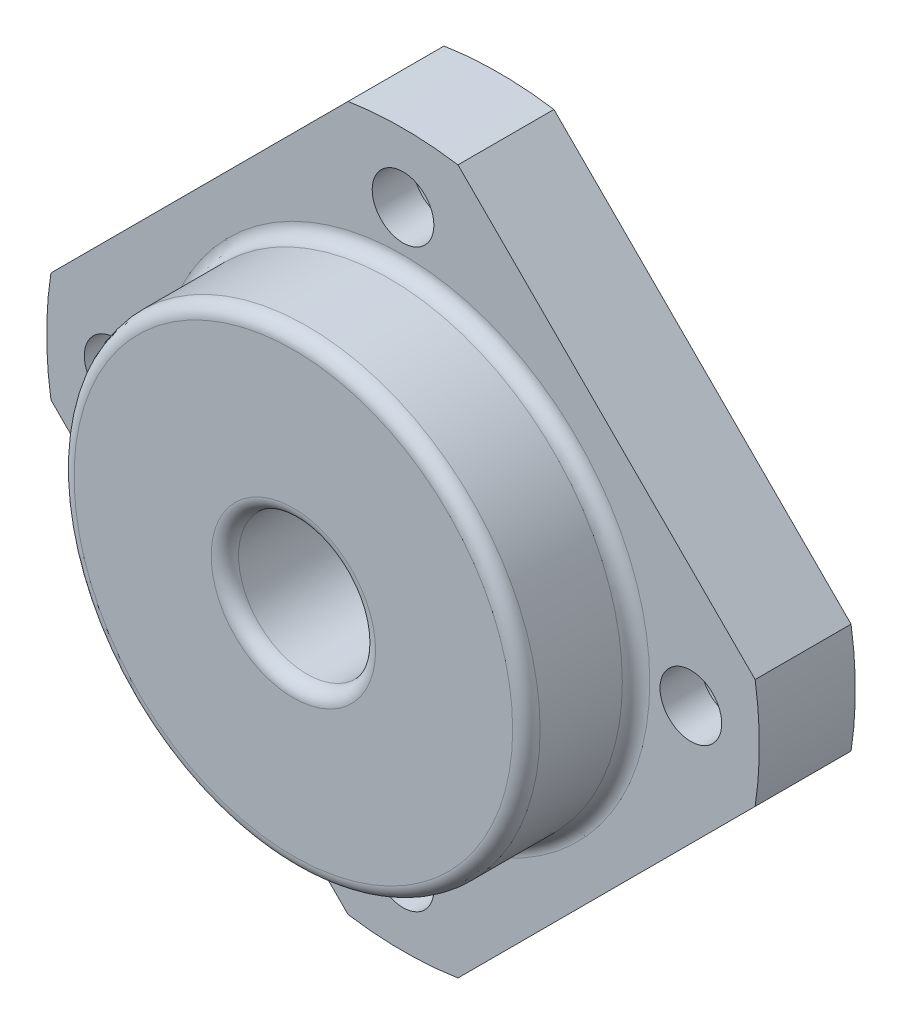
ISO-10303-21;
HEADER;
FILE_DESCRIPTION(('STEP AP214'),'2;1');
FILE_NAME('part.step','',(''),(''),'','','');
FILE_SCHEMA(('AUTOMOTIVE_DESIGN { 1 0 10303 214 1 1 1 1 }'));
ENDSEC;
DATA;
#1=APPLICATION_CONTEXT('core data for automotive mechanical design processes');
#2=APPLICATION_PROTOCOL_DEFINITION('international standard','automotive_design',2000,#1);
#3=PRODUCT_CONTEXT('',#1,'mechanical');
#4=PRODUCT('Part','Part','',(#3));
#5=PRODUCT_RELATED_PRODUCT_CATEGORY('part','',(#4));
#6=PRODUCT_DEFINITION_FORMATION('','',#4);
#7=PRODUCT_DEFINITION_CONTEXT('part definition',#1,'design');
#8=PRODUCT_DEFINITION('design','',#6,#7);
#9=PRODUCT_DEFINITION_SHAPE('','',#8);
#10=(LENGTH_UNIT() NAMED_UNIT(*) SI_UNIT(.MILLI.,.METRE.));
#11=(NAMED_UNIT(*) PLANE_ANGLE_UNIT() SI_UNIT($,.RADIAN.));
#12=(NAMED_UNIT(*) SI_UNIT($,.STERADIAN.) SOLID_ANGLE_UNIT());
#13=UNCERTAINTY_MEASURE_WITH_UNIT(LENGTH_MEASURE(1.E-05),#10,'distance_accuracy_value','');
#14=(GEOMETRIC_REPRESENTATION_CONTEXT(3) GLOBAL_UNCERTAINTY_ASSIGNED_CONTEXT((#13)) GLOBAL_UNIT_ASSIGNED_CONTEXT((#10,
#11,#12)) REPRESENTATION_CONTEXT('',''));
#15=CARTESIAN_POINT('',(0.,0.,0.));
#16=DIRECTION('',(0.,0.,1.));
#17=DIRECTION('',(1.,0.,0.));
#18=AXIS2_PLACEMENT_3D('',#15,#16,#17);
#19=CARTESIAN_POINT('',(14.8492424049174,14.8492424049176,7.));
#20=DIRECTION('',(-0.707106781186539,-0.707106781186556,0.));
#21=DIRECTION('',(0.707106781186556,-0.707106781186539,0.));
#22=AXIS2_PLACEMENT_3D('',#19,#20,#21);
#23=PLANE('',#22);
#24=DIRECTION('',(-0.707106781186556,0.707106781186539,0.));
#25=VECTOR('',#24,1.);
#26=CARTESIAN_POINT('',(14.8492424049174,14.8492424049176,0.));
#27=LINE('',#26,#25);
#28=CARTESIAN_POINT('',(25.6889840992569,4.00950071057832,0.));
#29=VERTEX_POINT('',#28);
#30=CARTESIAN_POINT('',(4.00950071057779,25.688984099257,0.));
#31=VERTEX_POINT('',#30);
#32=EDGE_CURVE('E86',#29,#31,#27,.T.);
#33=ORIENTED_EDGE('',*,*,#32,.T.);
#34=DIRECTION('',(0.,0.,-1.));
#35=VECTOR('',#34,1.);
#36=CARTESIAN_POINT('',(4.00950071057779,25.688984099257,7.));
#37=LINE('',#36,#35);
#38=CARTESIAN_POINT('',(4.00950071057779,25.688984099257,7.));
#39=VERTEX_POINT('',#38);
#40=EDGE_CURVE('E160',#39,#31,#37,.T.);
#41=ORIENTED_EDGE('',*,*,#40,.F.);
#42=DIRECTION('',(-0.707106781186554,0.707106781186541,0.));
#43=VECTOR('',#42,1.);
#44=CARTESIAN_POINT('',(14.8492424049174,14.8492424049176,7.));
#45=LINE('',#44,#43);
#46=CARTESIAN_POINT('',(25.6889840992569,4.00950071057832,7.));
#47=VERTEX_POINT('',#46);
#48=EDGE_CURVE('E92',#47,#39,#45,.T.);
#49=ORIENTED_EDGE('',*,*,#48,.F.);
#50=DIRECTION('',(0.,0.,-1.));
#51=VECTOR('',#50,1.);
#52=CARTESIAN_POINT('',(25.6889840992569,4.00950071057832,7.));
#53=LINE('',#52,#51);
#54=EDGE_CURVE('E127',#47,#29,#53,.T.);
#55=ORIENTED_EDGE('',*,*,#54,.T.);
#56=EDGE_LOOP('',(#33,#41,#49,#55));
#57=FACE_BOUND('',#56,.T.);
#58=ADVANCED_FACE('F34',(#57),#23,.F.);
#59=CARTESIAN_POINT('',(0.,0.,7.));
#60=DIRECTION('',(0.,0.,-1.));
#61=DIRECTION('',(-1.,0.,0.));
#62=AXIS2_PLACEMENT_3D('',#59,#60,#61);
#63=CYLINDRICAL_SURFACE('',#62,26.);
#64=CARTESIAN_POINT('',(0.,0.,0.));
#65=DIRECTION('',(0.,0.,1.));
#66=DIRECTION('',(1.,0.,0.));
#67=AXIS2_PLACEMENT_3D('',#64,#65,#66);
#68=CIRCLE('',#67,26.);
#69=CARTESIAN_POINT('',(-4.00950071057814,25.6889840992569,0.));
#70=VERTEX_POINT('',#69);
#71=EDGE_CURVE('E132',#31,#70,#68,.T.);
#72=ORIENTED_EDGE('',*,*,#71,.T.);
#73=DIRECTION('',(0.,0.,-1.));
#74=VECTOR('',#73,1.);
#75=CARTESIAN_POINT('',(-4.00950071057814,25.6889840992569,7.));
#76=LINE('',#75,#74);
#77=CARTESIAN_POINT('',(-4.00950071057814,25.6889840992569,7.));
#78=VERTEX_POINT('',#77);
#79=EDGE_CURVE('E157',#78,#70,#76,.T.);
#80=ORIENTED_EDGE('',*,*,#79,.F.);
#81=CARTESIAN_POINT('',(0.,0.,7.));
#82=DIRECTION('',(0.,0.,1.));
#83=DIRECTION('',(1.,0.,0.));
#84=AXIS2_PLACEMENT_3D('',#81,#82,#83);
#85=CIRCLE('',#84,26.);
#86=EDGE_CURVE('E343',#39,#78,#85,.T.);
#87=ORIENTED_EDGE('',*,*,#86,.F.);
#88=ORIENTED_EDGE('',*,*,#40,.T.);
#89=EDGE_LOOP('',(#72,#80,#87,#88));
#90=FACE_BOUND('',#89,.T.);
#91=ADVANCED_FACE('F208',(#90),#63,.T.);
#92=CARTESIAN_POINT('',(-14.8492424049176,14.8492424049174,7.));
#93=DIRECTION('',(0.707106781186554,-0.707106781186541,0.));
#94=DIRECTION('',(0.707106781186541,0.707106781186554,0.));
#95=AXIS2_PLACEMENT_3D('',#92,#93,#94);
#96=PLANE('',#95);
#97=DIRECTION('',(-0.707106781186541,-0.707106781186554,0.));
#98=VECTOR('',#97,1.);
#99=CARTESIAN_POINT('',(-14.8492424049176,14.8492424049174,0.));
#100=LINE('',#99,#98);
#101=CARTESIAN_POINT('',(-25.6889840992569,4.00950071057788,0.));
#102=VERTEX_POINT('',#101);
#103=EDGE_CURVE('E136',#70,#102,#100,.T.);
#104=ORIENTED_EDGE('',*,*,#103,.T.);
#105=DIRECTION('',(0.,0.,-1.));
#106=VECTOR('',#105,1.);
#107=CARTESIAN_POINT('',(-25.6889840992569,4.00950071057788,7.));
#108=LINE('',#107,#106);
#109=CARTESIAN_POINT('',(-25.6889840992569,4.00950071057788,7.));
#110=VERTEX_POINT('',#109);
#111=EDGE_CURVE('E154',#110,#102,#108,.T.);
#112=ORIENTED_EDGE('',*,*,#111,.F.);
#113=DIRECTION('',(-0.707106781186546,-0.707106781186549,0.));
#114=VECTOR('',#113,1.);
#115=CARTESIAN_POINT('',(-14.8492424049176,14.8492424049174,7.));
#116=LINE('',#115,#114);
#117=EDGE_CURVE('E345',#78,#110,#116,.T.);
#118=ORIENTED_EDGE('',*,*,#117,.F.);
#119=ORIENTED_EDGE('',*,*,#79,.T.);
#120=EDGE_LOOP('',(#104,#112,#118,#119));
#121=FACE_BOUND('',#120,.T.);
#122=ADVANCED_FACE('F214',(#121),#96,.F.);
#123=CARTESIAN_POINT('',(0.,0.,7.));
#124=DIRECTION('',(0.,0.,-1.));
#125=DIRECTION('',(-1.,0.,0.));
#126=AXIS2_PLACEMENT_3D('',#123,#124,#125);
#127=CYLINDRICAL_SURFACE('',#126,26.);
#128=CARTESIAN_POINT('',(0.,0.,0.));
#129=DIRECTION('',(0.,0.,1.));
#130=DIRECTION('',(1.,0.,0.));
#131=AXIS2_PLACEMENT_3D('',#128,#129,#130);
#132=CIRCLE('',#131,26.);
#133=CARTESIAN_POINT('',(-25.6889840992569,-4.00950071057823,0.));
#134=VERTEX_POINT('',#133);
#135=EDGE_CURVE('E138',#102,#134,#132,.T.);
#136=ORIENTED_EDGE('',*,*,#135,.T.);
#137=DIRECTION('',(0.,0.,-1.));
#138=VECTOR('',#137,1.);
#139=CARTESIAN_POINT('',(-25.6889840992569,-4.00950071057823,7.));
#140=LINE('',#139,#138);
#141=CARTESIAN_POINT('',(-25.6889840992569,-4.00950071057823,7.));
#142=VERTEX_POINT('',#141);
#143=EDGE_CURVE('E151',#142,#134,#140,.T.);
#144=ORIENTED_EDGE('',*,*,#143,.F.);
#145=CARTESIAN_POINT('',(0.,0.,7.));
#146=DIRECTION('',(0.,0.,1.));
#147=DIRECTION('',(1.,0.,0.));
#148=AXIS2_PLACEMENT_3D('',#145,#146,#147);
#149=CIRCLE('',#148,26.);
#150=EDGE_CURVE('E347',#110,#142,#149,.T.);
#151=ORIENTED_EDGE('',*,*,#150,.F.);
#152=ORIENTED_EDGE('',*,*,#111,.T.);
#153=EDGE_LOOP('',(#136,#144,#151,#152));
#154=FACE_BOUND('',#153,.T.);
#155=ADVANCED_FACE('F220',(#154),#127,.T.);
#156=CARTESIAN_POINT('',(-14.8492424049174,-14.8492424049176,7.));
#157=DIRECTION('',(0.707106781186541,0.707106781186554,0.));
#158=DIRECTION('',(-0.707106781186554,0.707106781186541,0.));
#159=AXIS2_PLACEMENT_3D('',#156,#157,#158);
#160=PLANE('',#159);
#161=DIRECTION('',(0.707106781186554,-0.707106781186541,0.));
#162=VECTOR('',#161,1.);
#163=CARTESIAN_POINT('',(-14.8492424049174,-14.8492424049176,0.));
#164=LINE('',#163,#162);
#165=CARTESIAN_POINT('',(-4.00950071057787,-25.6889840992569,0.));
#166=VERTEX_POINT('',#165);
#167=EDGE_CURVE('E141',#134,#166,#164,.T.);
#168=ORIENTED_EDGE('',*,*,#167,.T.);
#169=DIRECTION('',(0.,0.,-1.));
#170=VECTOR('',#169,1.);
#171=CARTESIAN_POINT('',(-4.00950071057787,-25.6889840992569,7.));
#172=LINE('',#171,#170);
#173=CARTESIAN_POINT('',(-4.00950071057787,-25.6889840992569,7.));
#174=VERTEX_POINT('',#173);
#175=EDGE_CURVE('E122',#174,#166,#172,.T.);
#176=ORIENTED_EDGE('',*,*,#175,.F.);
#177=DIRECTION('',(0.707106781186552,-0.707106781186544,0.));
#178=VECTOR('',#177,1.);
#179=CARTESIAN_POINT('',(-14.8492424049174,-14.8492424049176,7.));
#180=LINE('',#179,#178);
#181=EDGE_CURVE('E112',#142,#174,#180,.T.);
#182=ORIENTED_EDGE('',*,*,#181,.F.);
#183=ORIENTED_EDGE('',*,*,#143,.T.);
#184=EDGE_LOOP('',(#168,#176,#182,#183));
#185=FACE_BOUND('',#184,.T.);
#186=ADVANCED_FACE('F224',(#185),#160,.F.);
#187=CARTESIAN_POINT('',(0.,0.,7.));
#188=DIRECTION('',(0.,0.,-1.));
#189=DIRECTION('',(-1.,0.,0.));
#190=AXIS2_PLACEMENT_3D('',#187,#188,#189);
#191=CYLINDRICAL_SURFACE('',#190,26.);
#192=CARTESIAN_POINT('',(0.,0.,0.));
#193=DIRECTION('',(0.,0.,1.));
#194=DIRECTION('',(1.,0.,0.));
#195=AXIS2_PLACEMENT_3D('',#192,#193,#194);
#196=CIRCLE('',#195,26.);
#197=CARTESIAN_POINT('',(4.00950071057833,-25.6889840992569,0.));
#198=VERTEX_POINT('',#197);
#199=EDGE_CURVE('E121',#166,#198,#196,.T.);
#200=ORIENTED_EDGE('',*,*,#199,.T.);
#201=DIRECTION('',(0.,0.,-1.));
#202=VECTOR('',#201,1.);
#203=CARTESIAN_POINT('',(4.00950071057833,-25.6889840992569,7.));
#204=LINE('',#203,#202);
#205=CARTESIAN_POINT('',(4.00950071057833,-25.6889840992569,7.));
#206=VERTEX_POINT('',#205);
#207=EDGE_CURVE('E118',#206,#198,#204,.T.);
#208=ORIENTED_EDGE('',*,*,#207,.F.);
#209=CARTESIAN_POINT('',(0.,0.,7.));
#210=DIRECTION('',(0.,0.,1.));
#211=DIRECTION('',(1.,0.,0.));
#212=AXIS2_PLACEMENT_3D('',#209,#210,#211);
#213=CIRCLE('',#212,26.);
#214=EDGE_CURVE('E106',#174,#206,#213,.T.);
#215=ORIENTED_EDGE('',*,*,#214,.F.);
#216=ORIENTED_EDGE('',*,*,#175,.T.);
#217=EDGE_LOOP('',(#200,#208,#215,#216));
#218=FACE_BOUND('',#217,.T.);
#219=ADVANCED_FACE('F119',(#218),#191,.T.);
#220=CARTESIAN_POINT('',(14.8492424049176,-14.8492424049174,7.));
#221=DIRECTION('',(-0.707106781186559,0.707106781186536,0.));
#222=DIRECTION('',(-0.707106781186536,-0.707106781186559,0.));
#223=AXIS2_PLACEMENT_3D('',#220,#221,#222);
#224=PLANE('',#223);
#225=DIRECTION('',(0.707106781186536,0.707106781186559,0.));
#226=VECTOR('',#225,1.);
#227=CARTESIAN_POINT('',(14.8492424049176,-14.8492424049174,0.));
#228=LINE('',#227,#226);
#229=CARTESIAN_POINT('',(25.688984099257,-4.0095007105777,0.));
#230=VERTEX_POINT('',#229);
#231=EDGE_CURVE('E79',#198,#230,#228,.T.);
#232=ORIENTED_EDGE('',*,*,#231,.T.);
#233=DIRECTION('',(0.,0.,-1.));
#234=VECTOR('',#233,1.);
#235=CARTESIAN_POINT('',(25.688984099257,-4.0095007105777,7.));
#236=LINE('',#235,#234);
#237=CARTESIAN_POINT('',(25.688984099257,-4.0095007105777,7.));
#238=VERTEX_POINT('',#237);
#239=EDGE_CURVE('E123',#238,#230,#236,.T.);
#240=ORIENTED_EDGE('',*,*,#239,.F.);
#241=DIRECTION('',(0.707106781186541,0.707106781186554,0.));
#242=VECTOR('',#241,1.);
#243=CARTESIAN_POINT('',(14.8492424049176,-14.8492424049174,7.));
#244=LINE('',#243,#242);
#245=EDGE_CURVE('E110',#206,#238,#244,.T.);
#246=ORIENTED_EDGE('',*,*,#245,.F.);
#247=ORIENTED_EDGE('',*,*,#207,.T.);
#248=EDGE_LOOP('',(#232,#240,#246,#247));
#249=FACE_BOUND('',#248,.T.);
#250=ADVANCED_FACE('F125',(#249),#224,.F.);
#251=CARTESIAN_POINT('',(0.,0.,7.));
#252=DIRECTION('',(0.,0.,-1.));
#253=DIRECTION('',(-1.,0.,0.));
#254=AXIS2_PLACEMENT_3D('',#251,#252,#253);
#255=CYLINDRICAL_SURFACE('',#254,26.);
#256=CARTESIAN_POINT('',(0.,0.,0.));
#257=DIRECTION('',(0.,0.,1.));
#258=DIRECTION('',(1.,0.,0.));
#259=AXIS2_PLACEMENT_3D('',#256,#257,#258);
#260=CIRCLE('',#259,26.);
#261=EDGE_CURVE('E145',#230,#29,#260,.T.);
#262=ORIENTED_EDGE('',*,*,#261,.T.);
#263=ORIENTED_EDGE('',*,*,#54,.F.);
#264=CARTESIAN_POINT('',(0.,0.,7.));
#265=DIRECTION('',(0.,0.,1.));
#266=DIRECTION('',(1.,0.,0.));
#267=AXIS2_PLACEMENT_3D('',#264,#265,#266);
#268=CIRCLE('',#267,26.);
#269=EDGE_CURVE('E51',#238,#47,#268,.T.);
#270=ORIENTED_EDGE('',*,*,#269,.F.);
#271=ORIENTED_EDGE('',*,*,#239,.T.);
#272=EDGE_LOOP('',(#262,#263,#270,#271));
#273=FACE_BOUND('',#272,.T.);
#274=ADVANCED_FACE('F233',(#273),#255,.T.);
#275=CARTESIAN_POINT('',(0.,0.,7.));
#276=DIRECTION('',(0.,0.,1.));
#277=DIRECTION('',(1.,0.,0.));
#278=AXIS2_PLACEMENT_3D('',#275,#276,#277);
#279=PLANE('',#278);
#280=CARTESIAN_POINT('',(0.,0.,7.));
#281=DIRECTION('',(0.,0.,1.));
#282=DIRECTION('',(1.,0.,0.));
#283=AXIS2_PLACEMENT_3D('',#280,#281,#282);
#284=CIRCLE('',#283,18.);
#285=CARTESIAN_POINT('',(18.,0.,7.));
#286=VERTEX_POINT('',#285);
#287=EDGE_CURVE('E183',#286,#286,#284,.F.);
#288=ORIENTED_EDGE('',*,*,#287,.T.);
#289=EDGE_LOOP('',(#288));
#290=FACE_BOUND('',#289,.T.);
#291=CARTESIAN_POINT('',(0.,21.0000000000001,7.));
#292=DIRECTION('',(0.,0.,1.));
#293=DIRECTION('',(1.,0.,0.));
#294=AXIS2_PLACEMENT_3D('',#291,#292,#293);
#295=CIRCLE('',#294,2.25);
#296=CARTESIAN_POINT('',(2.25,21.0000000000001,7.));
#297=VERTEX_POINT('',#296);
#298=EDGE_CURVE('E174',#297,#297,#295,.T.);
#299=ORIENTED_EDGE('',*,*,#298,.F.);
#300=EDGE_LOOP('',(#299));
#301=FACE_BOUND('',#300,.T.);
#302=CARTESIAN_POINT('',(21.0000000000001,0.,7.));
#303=DIRECTION('',(0.,0.,1.));
#304=DIRECTION('',(1.,0.,0.));
#305=AXIS2_PLACEMENT_3D('',#302,#303,#304);
#306=CIRCLE('',#305,2.25);
#307=CARTESIAN_POINT('',(23.2500000000001,0.,7.));
#308=VERTEX_POINT('',#307);
#309=EDGE_CURVE('E171',#308,#308,#306,.T.);
#310=ORIENTED_EDGE('',*,*,#309,.F.);
#311=EDGE_LOOP('',(#310));
#312=FACE_BOUND('',#311,.T.);
#313=CARTESIAN_POINT('',(-21.0000000000001,0.,7.));
#314=DIRECTION('',(0.,0.,1.));
#315=DIRECTION('',(1.,0.,0.));
#316=AXIS2_PLACEMENT_3D('',#313,#314,#315);
#317=CIRCLE('',#316,2.25);
#318=CARTESIAN_POINT('',(-18.7500000000001,0.,7.));
#319=VERTEX_POINT('',#318);
#320=EDGE_CURVE('E167',#319,#319,#317,.T.);
#321=ORIENTED_EDGE('',*,*,#320,.F.);
#322=EDGE_LOOP('',(#321));
#323=FACE_BOUND('',#322,.T.);
#324=CARTESIAN_POINT('',(0.,-21.0000000000001,7.));
#325=DIRECTION('',(0.,0.,1.));
#326=DIRECTION('',(1.,0.,0.));
#327=AXIS2_PLACEMENT_3D('',#324,#325,#326);
#328=CIRCLE('',#327,2.25);
#329=CARTESIAN_POINT('',(2.25,-21.0000000000001,7.));
#330=VERTEX_POINT('',#329);
#331=EDGE_CURVE('E164',#330,#330,#328,.T.);
#332=ORIENTED_EDGE('',*,*,#331,.F.);
#333=EDGE_LOOP('',(#332));
#334=FACE_BOUND('',#333,.T.);
#335=ORIENTED_EDGE('',*,*,#48,.T.);
#336=ORIENTED_EDGE('',*,*,#86,.T.);
#337=ORIENTED_EDGE('',*,*,#117,.T.);
#338=ORIENTED_EDGE('',*,*,#150,.T.);
#339=ORIENTED_EDGE('',*,*,#181,.T.);
#340=ORIENTED_EDGE('',*,*,#214,.T.);
#341=ORIENTED_EDGE('',*,*,#245,.T.);
#342=ORIENTED_EDGE('',*,*,#269,.T.);
#343=EDGE_LOOP('',(#335,#336,#337,#338,#339,#340,#341,#342));
#344=FACE_BOUND('',#343,.T.);
#345=ADVANCED_FACE('F108',(#290,#301,#312,#323,#334,#344),#279,.T.);
#346=CARTESIAN_POINT('',(0.,0.,0.));
#347=DIRECTION('',(0.,0.,1.));
#348=DIRECTION('',(1.,0.,0.));
#349=AXIS2_PLACEMENT_3D('',#346,#347,#348);
#350=PLANE('',#349);
#351=CARTESIAN_POINT('',(0.,0.,0.));
#352=DIRECTION('',(0.,0.,1.));
#353=DIRECTION('',(1.,0.,0.));
#354=AXIS2_PLACEMENT_3D('',#351,#352,#353);
#355=CIRCLE('',#354,5.);
#356=CARTESIAN_POINT('',(5.,0.,0.));
#357=VERTEX_POINT('',#356);
#358=EDGE_CURVE('E306',#357,#357,#355,.T.);
#359=ORIENTED_EDGE('',*,*,#358,.T.);
#360=EDGE_LOOP('',(#359));
#361=FACE_BOUND('',#360,.T.);
#362=CARTESIAN_POINT('',(21.0000000000001,0.,0.));
#363=DIRECTION('',(0.,0.,-1.));
#364=DIRECTION('',(-1.,0.,0.));
#365=AXIS2_PLACEMENT_3D('',#362,#363,#364);
#366=CIRCLE('',#365,4.);
#367=CARTESIAN_POINT('',(17.0000000000001,0.,0.));
#368=VERTEX_POINT('',#367);
#369=EDGE_CURVE('E322',#368,#368,#366,.T.);
#370=ORIENTED_EDGE('',*,*,#369,.F.);
#371=EDGE_LOOP('',(#370));
#372=FACE_BOUND('',#371,.T.);
#373=CARTESIAN_POINT('',(0.,21.0000000000001,0.));
#374=DIRECTION('',(0.,0.,-1.));
#375=DIRECTION('',(-1.,0.,0.));
#376=AXIS2_PLACEMENT_3D('',#373,#374,#375);
#377=CIRCLE('',#376,4.);
#378=CARTESIAN_POINT('',(-4.,21.0000000000001,0.));
#379=VERTEX_POINT('',#378);
#380=EDGE_CURVE('E325',#379,#379,#377,.T.);
#381=ORIENTED_EDGE('',*,*,#380,.F.);
#382=EDGE_LOOP('',(#381));
#383=FACE_BOUND('',#382,.T.);
#384=CARTESIAN_POINT('',(-21.0000000000001,0.,0.));
#385=DIRECTION('',(0.,0.,-1.));
#386=DIRECTION('',(-1.,0.,0.));
#387=AXIS2_PLACEMENT_3D('',#384,#385,#386);
#388=CIRCLE('',#387,4.);
#389=CARTESIAN_POINT('',(-25.0000000000001,0.,0.));
#390=VERTEX_POINT('',#389);
#391=EDGE_CURVE('E331',#390,#390,#388,.T.);
#392=ORIENTED_EDGE('',*,*,#391,.F.);
#393=EDGE_LOOP('',(#392));
#394=FACE_BOUND('',#393,.T.);
#395=CARTESIAN_POINT('',(0.,-21.0000000000001,0.));
#396=DIRECTION('',(0.,0.,-1.));
#397=DIRECTION('',(-1.,0.,0.));
#398=AXIS2_PLACEMENT_3D('',#395,#396,#397);
#399=CIRCLE('',#398,4.);
#400=CARTESIAN_POINT('',(-4.,-21.0000000000001,0.));
#401=VERTEX_POINT('',#400);
#402=EDGE_CURVE('E337',#401,#401,#399,.T.);
#403=ORIENTED_EDGE('',*,*,#402,.F.);
#404=EDGE_LOOP('',(#403));
#405=FACE_BOUND('',#404,.T.);
#406=ORIENTED_EDGE('',*,*,#32,.F.);
#407=ORIENTED_EDGE('',*,*,#261,.F.);
#408=ORIENTED_EDGE('',*,*,#231,.F.);
#409=ORIENTED_EDGE('',*,*,#199,.F.);
#410=ORIENTED_EDGE('',*,*,#167,.F.);
#411=ORIENTED_EDGE('',*,*,#135,.F.);
#412=ORIENTED_EDGE('',*,*,#103,.F.);
#413=ORIENTED_EDGE('',*,*,#71,.F.);
#414=EDGE_LOOP('',(#406,#407,#408,#409,#410,#411,#412,#413));
#415=FACE_BOUND('',#414,.T.);
#416=ADVANCED_FACE('F237',(#361,#372,#383,#394,#405,#415),#350,.F.);
#417=CARTESIAN_POINT('',(0.,-21.0000000000001,4.));
#418=DIRECTION('',(0.,0.,-1.));
#419=DIRECTION('',(-1.,0.,0.));
#420=AXIS2_PLACEMENT_3D('',#417,#418,#419);
#421=CYLINDRICAL_SURFACE('',#420,4.);
#422=CARTESIAN_POINT('',(0.,-21.0000000000001,4.));
#423=DIRECTION('',(0.,0.,-1.));
#424=DIRECTION('',(-1.,0.,0.));
#425=AXIS2_PLACEMENT_3D('',#422,#423,#424);
#426=CIRCLE('',#425,4.);
#427=CARTESIAN_POINT('',(-4.,-21.0000000000001,4.));
#428=VERTEX_POINT('',#427);
#429=EDGE_CURVE('E177',#428,#428,#426,.T.);
#430=ORIENTED_EDGE('',*,*,#429,.F.);
#431=EDGE_LOOP('',(#430));
#432=FACE_BOUND('',#431,.T.);
#433=ORIENTED_EDGE('',*,*,#402,.T.);
#434=EDGE_LOOP('',(#433));
#435=FACE_BOUND('',#434,.T.);
#436=ADVANCED_FACE('F240',(#432,#435),#421,.F.);
#437=CARTESIAN_POINT('',(0.,-21.0000000000001,4.));
#438=DIRECTION('',(0.,0.,-1.));
#439=DIRECTION('',(-1.,0.,0.));
#440=AXIS2_PLACEMENT_3D('',#437,#438,#439);
#441=PLANE('',#440);
#442=CARTESIAN_POINT('',(0.,-21.0000000000001,4.));
#443=DIRECTION('',(0.,0.,-1.));
#444=DIRECTION('',(-1.,0.,0.));
#445=AXIS2_PLACEMENT_3D('',#442,#443,#444);
#446=CIRCLE('',#445,2.25);
#447=CARTESIAN_POINT('',(-2.25,-21.0000000000001,4.));
#448=VERTEX_POINT('',#447);
#449=EDGE_CURVE('E307',#448,#448,#446,.T.);
#450=ORIENTED_EDGE('',*,*,#449,.F.);
#451=EDGE_LOOP('',(#450));
#452=FACE_BOUND('',#451,.T.);
#453=ORIENTED_EDGE('',*,*,#429,.T.);
#454=EDGE_LOOP('',(#453));
#455=FACE_BOUND('',#454,.T.);
#456=ADVANCED_FACE('F245',(#452,#455),#441,.T.);
#457=CARTESIAN_POINT('',(-21.0000000000001,0.,4.));
#458=DIRECTION('',(0.,0.,-1.));
#459=DIRECTION('',(-1.,0.,0.));
#460=AXIS2_PLACEMENT_3D('',#457,#458,#459);
#461=CYLINDRICAL_SURFACE('',#460,4.);
#462=CARTESIAN_POINT('',(-21.0000000000001,0.,4.));
#463=DIRECTION('',(0.,0.,-1.));
#464=DIRECTION('',(-1.,0.,0.));
#465=AXIS2_PLACEMENT_3D('',#462,#463,#464);
#466=CIRCLE('',#465,4.);
#467=CARTESIAN_POINT('',(-25.0000000000001,0.,4.));
#468=VERTEX_POINT('',#467);
#469=EDGE_CURVE('E334',#468,#468,#466,.T.);
#470=ORIENTED_EDGE('',*,*,#469,.F.);
#471=EDGE_LOOP('',(#470));
#472=FACE_BOUND('',#471,.T.);
#473=ORIENTED_EDGE('',*,*,#391,.T.);
#474=EDGE_LOOP('',(#473));
#475=FACE_BOUND('',#474,.T.);
#476=ADVANCED_FACE('F248',(#472,#475),#461,.F.);
#477=CARTESIAN_POINT('',(-21.0000000000001,0.,4.));
#478=DIRECTION('',(0.,0.,-1.));
#479=DIRECTION('',(-1.,0.,0.));
#480=AXIS2_PLACEMENT_3D('',#477,#478,#479);
#481=PLANE('',#480);
#482=CARTESIAN_POINT('',(-21.0000000000001,0.,4.));
#483=DIRECTION('',(0.,0.,-1.));
#484=DIRECTION('',(-1.,0.,0.));
#485=AXIS2_PLACEMENT_3D('',#482,#483,#484);
#486=CIRCLE('',#485,2.25);
#487=CARTESIAN_POINT('',(-23.2500000000001,0.,4.));
#488=VERTEX_POINT('',#487);
#489=EDGE_CURVE('E310',#488,#488,#486,.T.);
#490=ORIENTED_EDGE('',*,*,#489,.F.);
#491=EDGE_LOOP('',(#490));
#492=FACE_BOUND('',#491,.T.);
#493=ORIENTED_EDGE('',*,*,#469,.T.);
#494=EDGE_LOOP('',(#493));
#495=FACE_BOUND('',#494,.T.);
#496=ADVANCED_FACE('F253',(#492,#495),#481,.T.);
#497=CARTESIAN_POINT('',(0.,21.0000000000001,4.));
#498=DIRECTION('',(0.,0.,-1.));
#499=DIRECTION('',(-1.,0.,0.));
#500=AXIS2_PLACEMENT_3D('',#497,#498,#499);
#501=CYLINDRICAL_SURFACE('',#500,4.);
#502=CARTESIAN_POINT('',(0.,21.0000000000001,4.));
#503=DIRECTION('',(0.,0.,-1.));
#504=DIRECTION('',(-1.,0.,0.));
#505=AXIS2_PLACEMENT_3D('',#502,#503,#504);
#506=CIRCLE('',#505,4.);
#507=CARTESIAN_POINT('',(-4.,21.0000000000001,4.));
#508=VERTEX_POINT('',#507);
#509=EDGE_CURVE('E328',#508,#508,#506,.T.);
#510=ORIENTED_EDGE('',*,*,#509,.F.);
#511=EDGE_LOOP('',(#510));
#512=FACE_BOUND('',#511,.T.);
#513=ORIENTED_EDGE('',*,*,#380,.T.);
#514=EDGE_LOOP('',(#513));
#515=FACE_BOUND('',#514,.T.);
#516=ADVANCED_FACE('F256',(#512,#515),#501,.F.);
#517=CARTESIAN_POINT('',(0.,21.0000000000001,4.));
#518=DIRECTION('',(0.,0.,-1.));
#519=DIRECTION('',(-1.,0.,0.));
#520=AXIS2_PLACEMENT_3D('',#517,#518,#519);
#521=PLANE('',#520);
#522=CARTESIAN_POINT('',(0.,21.0000000000001,4.));
#523=DIRECTION('',(0.,0.,-1.));
#524=DIRECTION('',(-1.,0.,0.));
#525=AXIS2_PLACEMENT_3D('',#522,#523,#524);
#526=CIRCLE('',#525,2.25);
#527=CARTESIAN_POINT('',(-2.25,21.0000000000001,4.));
#528=VERTEX_POINT('',#527);
#529=EDGE_CURVE('E168',#528,#528,#526,.T.);
#530=ORIENTED_EDGE('',*,*,#529,.F.);
#531=EDGE_LOOP('',(#530));
#532=FACE_BOUND('',#531,.T.);
#533=ORIENTED_EDGE('',*,*,#509,.T.);
#534=EDGE_LOOP('',(#533));
#535=FACE_BOUND('',#534,.T.);
#536=ADVANCED_FACE('F261',(#532,#535),#521,.T.);
#537=CARTESIAN_POINT('',(21.0000000000001,0.,4.));
#538=DIRECTION('',(0.,0.,-1.));
#539=DIRECTION('',(-1.,0.,0.));
#540=AXIS2_PLACEMENT_3D('',#537,#538,#539);
#541=CYLINDRICAL_SURFACE('',#540,4.);
#542=CARTESIAN_POINT('',(21.0000000000001,0.,4.));
#543=DIRECTION('',(0.,0.,-1.));
#544=DIRECTION('',(-1.,0.,0.));
#545=AXIS2_PLACEMENT_3D('',#542,#543,#544);
#546=CIRCLE('',#545,4.);
#547=CARTESIAN_POINT('',(17.0000000000001,0.,4.));
#548=VERTEX_POINT('',#547);
#549=EDGE_CURVE('E133',#548,#548,#546,.T.);
#550=ORIENTED_EDGE('',*,*,#549,.F.);
#551=EDGE_LOOP('',(#550));
#552=FACE_BOUND('',#551,.T.);
#553=ORIENTED_EDGE('',*,*,#369,.T.);
#554=EDGE_LOOP('',(#553));
#555=FACE_BOUND('',#554,.T.);
#556=ADVANCED_FACE('F264',(#552,#555),#541,.F.);
#557=CARTESIAN_POINT('',(21.0000000000001,0.,4.));
#558=DIRECTION('',(0.,0.,-1.));
#559=DIRECTION('',(-1.,0.,0.));
#560=AXIS2_PLACEMENT_3D('',#557,#558,#559);
#561=PLANE('',#560);
#562=CARTESIAN_POINT('',(21.0000000000001,0.,4.));
#563=DIRECTION('',(0.,0.,-1.));
#564=DIRECTION('',(-1.,0.,0.));
#565=AXIS2_PLACEMENT_3D('',#562,#563,#564);
#566=CIRCLE('',#565,2.25);
#567=CARTESIAN_POINT('',(18.7500000000001,0.,4.));
#568=VERTEX_POINT('',#567);
#569=EDGE_CURVE('E315',#568,#568,#566,.T.);
#570=ORIENTED_EDGE('',*,*,#569,.F.);
#571=EDGE_LOOP('',(#570));
#572=FACE_BOUND('',#571,.T.);
#573=ORIENTED_EDGE('',*,*,#549,.T.);
#574=EDGE_LOOP('',(#573));
#575=FACE_BOUND('',#574,.T.);
#576=ADVANCED_FACE('F271',(#572,#575),#561,.T.);
#577=CARTESIAN_POINT('',(0.,-21.0000000000001,8.));
#578=DIRECTION('',(0.,0.,-1.));
#579=DIRECTION('',(-1.,0.,0.));
#580=AXIS2_PLACEMENT_3D('',#577,#578,#579);
#581=CYLINDRICAL_SURFACE('',#580,2.25);
#582=ORIENTED_EDGE('',*,*,#331,.T.);
#583=EDGE_LOOP('',(#582));
#584=FACE_BOUND('',#583,.T.);
#585=ORIENTED_EDGE('',*,*,#449,.T.);
#586=EDGE_LOOP('',(#585));
#587=FACE_BOUND('',#586,.T.);
#588=ADVANCED_FACE('F275',(#584,#587),#581,.F.);
#589=CARTESIAN_POINT('',(-21.0000000000001,0.,8.));
#590=DIRECTION('',(0.,0.,-1.));
#591=DIRECTION('',(-1.,0.,0.));
#592=AXIS2_PLACEMENT_3D('',#589,#590,#591);
#593=CYLINDRICAL_SURFACE('',#592,2.25);
#594=ORIENTED_EDGE('',*,*,#320,.T.);
#595=EDGE_LOOP('',(#594));
#596=FACE_BOUND('',#595,.T.);
#597=ORIENTED_EDGE('',*,*,#489,.T.);
#598=EDGE_LOOP('',(#597));
#599=FACE_BOUND('',#598,.T.);
#600=ADVANCED_FACE('F279',(#596,#599),#593,.F.);
#601=CARTESIAN_POINT('',(21.0000000000001,0.,8.));
#602=DIRECTION('',(0.,0.,-1.));
#603=DIRECTION('',(-1.,0.,0.));
#604=AXIS2_PLACEMENT_3D('',#601,#602,#603);
#605=CYLINDRICAL_SURFACE('',#604,2.25);
#606=ORIENTED_EDGE('',*,*,#309,.T.);
#607=EDGE_LOOP('',(#606));
#608=FACE_BOUND('',#607,.T.);
#609=ORIENTED_EDGE('',*,*,#569,.T.);
#610=EDGE_LOOP('',(#609));
#611=FACE_BOUND('',#610,.T.);
#612=ADVANCED_FACE('F283',(#608,#611),#605,.F.);
#613=CARTESIAN_POINT('',(0.,21.0000000000001,8.));
#614=DIRECTION('',(0.,0.,-1.));
#615=DIRECTION('',(-1.,0.,0.));
#616=AXIS2_PLACEMENT_3D('',#613,#614,#615);
#617=CYLINDRICAL_SURFACE('',#616,2.25);
#618=ORIENTED_EDGE('',*,*,#298,.T.);
#619=EDGE_LOOP('',(#618));
#620=FACE_BOUND('',#619,.T.);
#621=ORIENTED_EDGE('',*,*,#529,.T.);
#622=EDGE_LOOP('',(#621));
#623=FACE_BOUND('',#622,.T.);
#624=ADVANCED_FACE('F287',(#620,#623),#617,.F.);
#625=CARTESIAN_POINT('',(0.,0.,15.));
#626=DIRECTION('',(0.,0.,-1.));
#627=DIRECTION('',(-1.,0.,0.));
#628=AXIS2_PLACEMENT_3D('',#625,#626,#627);
#629=CYLINDRICAL_SURFACE('',#628,17.);
#630=CARTESIAN_POINT('',(0.,0.,8.));
#631=DIRECTION('',(0.,0.,1.));
#632=DIRECTION('',(1.,0.,0.));
#633=AXIS2_PLACEMENT_3D('',#630,#631,#632);
#634=CIRCLE('',#633,17.);
#635=CARTESIAN_POINT('',(17.,0.,8.));
#636=VERTEX_POINT('',#635);
#637=EDGE_CURVE('E180',#636,#636,#634,.T.);
#638=ORIENTED_EDGE('',*,*,#637,.T.);
#639=EDGE_LOOP('',(#638));
#640=FACE_BOUND('',#639,.T.);
#641=CARTESIAN_POINT('',(0.,0.,14.));
#642=DIRECTION('',(0.,0.,1.));
#643=DIRECTION('',(1.,0.,0.));
#644=AXIS2_PLACEMENT_3D('',#641,#642,#643);
#645=CIRCLE('',#644,17.);
#646=CARTESIAN_POINT('',(17.,0.,14.));
#647=VERTEX_POINT('',#646);
#648=EDGE_CURVE('E163',#647,#647,#645,.F.);
#649=ORIENTED_EDGE('',*,*,#648,.T.);
#650=EDGE_LOOP('',(#649));
#651=FACE_BOUND('',#650,.T.);
#652=ADVANCED_FACE('F291',(#640,#651),#629,.T.);
#653=CARTESIAN_POINT('',(0.,0.,15.));
#654=DIRECTION('',(0.,0.,1.));
#655=DIRECTION('',(1.,0.,0.));
#656=AXIS2_PLACEMENT_3D('',#653,#654,#655);
#657=PLANE('',#656);
#658=CARTESIAN_POINT('',(0.,0.,15.));
#659=DIRECTION('',(0.,0.,1.));
#660=DIRECTION('',(1.,0.,0.));
#661=AXIS2_PLACEMENT_3D('',#658,#659,#660);
#662=CIRCLE('',#661,16.);
#663=CARTESIAN_POINT('',(16.,0.,15.));
#664=VERTEX_POINT('',#663);
#665=EDGE_CURVE('E43',#664,#664,#662,.T.);
#666=ORIENTED_EDGE('',*,*,#665,.T.);
#667=EDGE_LOOP('',(#666));
#668=FACE_BOUND('',#667,.T.);
#669=CARTESIAN_POINT('',(0.,0.,15.));
#670=DIRECTION('',(0.,0.,1.));
#671=DIRECTION('',(1.,0.,0.));
#672=AXIS2_PLACEMENT_3D('',#669,#670,#671);
#673=CIRCLE('',#672,6.);
#674=CARTESIAN_POINT('',(6.,0.,15.));
#675=VERTEX_POINT('',#674);
#676=EDGE_CURVE('E186',#675,#675,#673,.F.);
#677=ORIENTED_EDGE('',*,*,#676,.T.);
#678=EDGE_LOOP('',(#677));
#679=FACE_BOUND('',#678,.T.);
#680=ADVANCED_FACE('F191',(#668,#679),#657,.T.);
#681=CARTESIAN_POINT('',(0.,0.,0.));
#682=DIRECTION('',(0.,0.,1.));
#683=DIRECTION('',(1.,0.,0.));
#684=AXIS2_PLACEMENT_3D('',#681,#682,#683);
#685=CYLINDRICAL_SURFACE('',#684,5.);
#686=CARTESIAN_POINT('',(0.,0.,14.));
#687=DIRECTION('',(0.,0.,1.));
#688=DIRECTION('',(1.,0.,0.));
#689=AXIS2_PLACEMENT_3D('',#686,#687,#688);
#690=CIRCLE('',#689,5.);
#691=CARTESIAN_POINT('',(5.,0.,14.));
#692=VERTEX_POINT('',#691);
#693=EDGE_CURVE('E11',#692,#692,#690,.T.);
#694=ORIENTED_EDGE('',*,*,#693,.T.);
#695=EDGE_LOOP('',(#694));
#696=FACE_BOUND('',#695,.T.);
#697=ORIENTED_EDGE('',*,*,#358,.F.);
#698=EDGE_LOOP('',(#697));
#699=FACE_BOUND('',#698,.T.);
#700=ADVANCED_FACE('F203',(#696,#699),#685,.F.);
#701=CARTESIAN_POINT('',(0.,0.,8.));
#702=DIRECTION('',(0.,0.,1.));
#703=DIRECTION('',(1.,0.,0.));
#704=AXIS2_PLACEMENT_3D('',#701,#702,#703);
#705=TOROIDAL_SURFACE('',#704,18.,1.);
#706=ORIENTED_EDGE('',*,*,#287,.F.);
#707=EDGE_LOOP('',(#706));
#708=FACE_BOUND('',#707,.T.);
#709=ORIENTED_EDGE('',*,*,#637,.F.);
#710=EDGE_LOOP('',(#709));
#711=FACE_BOUND('',#710,.T.);
#712=ADVANCED_FACE('F196',(#708,#711),#705,.F.);
#713=CARTESIAN_POINT('',(0.,0.,14.));
#714=DIRECTION('',(0.,0.,1.));
#715=DIRECTION('',(1.,0.,0.));
#716=AXIS2_PLACEMENT_3D('',#713,#714,#715);
#717=TOROIDAL_SURFACE('',#716,16.,1.);
#718=ORIENTED_EDGE('',*,*,#648,.F.);
#719=EDGE_LOOP('',(#718));
#720=FACE_BOUND('',#719,.T.);
#721=ORIENTED_EDGE('',*,*,#665,.F.);
#722=EDGE_LOOP('',(#721));
#723=FACE_BOUND('',#722,.T.);
#724=ADVANCED_FACE('F194',(#720,#723),#717,.T.);
#725=CARTESIAN_POINT('',(0.,0.,14.));
#726=DIRECTION('',(0.,0.,1.));
#727=DIRECTION('',(1.,0.,0.));
#728=AXIS2_PLACEMENT_3D('',#725,#726,#727);
#729=TOROIDAL_SURFACE('',#728,6.,1.);
#730=ORIENTED_EDGE('',*,*,#676,.F.);
#731=EDGE_LOOP('',(#730));
#732=FACE_BOUND('',#731,.T.);
#733=ORIENTED_EDGE('',*,*,#693,.F.);
#734=EDGE_LOOP('',(#733));
#735=FACE_BOUND('',#734,.T.);
#736=ADVANCED_FACE('F36',(#732,#735),#729,.T.);
#737=CLOSED_SHELL('',(#58,#91,#122,#155,#186,#219,#250,#274,#345,#416,#436,#456,#476,#496,#516,
#536,#556,#576,#588,#600,#612,#624,#652,#680,#700,#712,#724,#736));
#738=MANIFOLD_SOLID_BREP('B2',#737);
#739=ADVANCED_BREP_SHAPE_REPRESENTATION('',(#18,#738),#14);
#740=SHAPE_DEFINITION_REPRESENTATION(#9,#739);
ENDSEC;
END-ISO-10303-21;
